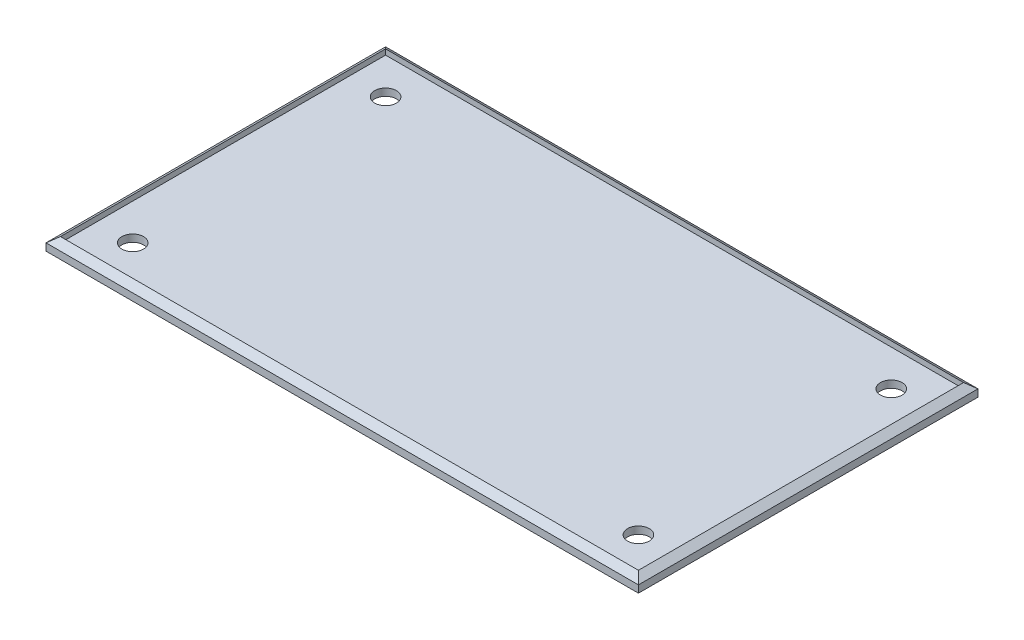
ISO-10303-21;
HEADER;
FILE_DESCRIPTION(('STEP AP214'),'2;1');
FILE_NAME('part.step','',(''),(''),'','','');
FILE_SCHEMA(('AUTOMOTIVE_DESIGN { 1 0 10303 214 1 1 1 1 }'));
ENDSEC;
DATA;
#1=APPLICATION_CONTEXT('core data for automotive mechanical design processes');
#2=APPLICATION_PROTOCOL_DEFINITION('international standard','automotive_design',2000,#1);
#3=PRODUCT_CONTEXT('',#1,'mechanical');
#4=PRODUCT('Part','Part','',(#3));
#5=PRODUCT_RELATED_PRODUCT_CATEGORY('part','',(#4));
#6=PRODUCT_DEFINITION_FORMATION('','',#4);
#7=PRODUCT_DEFINITION_CONTEXT('part definition',#1,'design');
#8=PRODUCT_DEFINITION('design','',#6,#7);
#9=PRODUCT_DEFINITION_SHAPE('','',#8);
#10=(LENGTH_UNIT() NAMED_UNIT(*) SI_UNIT(.MILLI.,.METRE.));
#11=(NAMED_UNIT(*) PLANE_ANGLE_UNIT() SI_UNIT($,.RADIAN.));
#12=(NAMED_UNIT(*) SI_UNIT($,.STERADIAN.) SOLID_ANGLE_UNIT());
#13=UNCERTAINTY_MEASURE_WITH_UNIT(LENGTH_MEASURE(1.E-05),#10,'distance_accuracy_value','');
#14=(GEOMETRIC_REPRESENTATION_CONTEXT(3) GLOBAL_UNCERTAINTY_ASSIGNED_CONTEXT((#13)) GLOBAL_UNIT_ASSIGNED_CONTEXT((#10,
#11,#12)) REPRESENTATION_CONTEXT('',''));
#15=CARTESIAN_POINT('',(0.,0.,0.));
#16=DIRECTION('',(0.,0.,1.));
#17=DIRECTION('',(1.,0.,0.));
#18=AXIS2_PLACEMENT_3D('',#15,#16,#17);
#19=CARTESIAN_POINT('',(-82.,0.,-45.));
#20=DIRECTION('',(-1.,0.,0.));
#21=DIRECTION('',(0.,0.,1.));
#22=AXIS2_PLACEMENT_3D('',#19,#20,#21);
#23=PLANE('',#22);
#24=DIRECTION('',(0.,1.,0.));
#25=VECTOR('',#24,1.);
#26=CARTESIAN_POINT('',(-82.,0.,47.));
#27=LINE('',#26,#25);
#28=CARTESIAN_POINT('',(-82.,0.,47.));
#29=VERTEX_POINT('',#28);
#30=CARTESIAN_POINT('',(-82.,1.99999999999998,47.));
#31=VERTEX_POINT('',#30);
#32=EDGE_CURVE('E219',#29,#31,#27,.T.);
#33=ORIENTED_EDGE('',*,*,#32,.T.);
#34=DIRECTION('',(0.,0.,1.));
#35=VECTOR('',#34,1.);
#36=CARTESIAN_POINT('',(-82.,2.,-45.));
#37=LINE('',#36,#35);
#38=CARTESIAN_POINT('',(-82.,2.,-47.));
#39=VERTEX_POINT('',#38);
#40=EDGE_CURVE('E166',#39,#31,#37,.T.);
#41=ORIENTED_EDGE('',*,*,#40,.F.);
#42=DIRECTION('',(0.,-1.,0.));
#43=VECTOR('',#42,1.);
#44=CARTESIAN_POINT('',(-82.,0.,-47.));
#45=LINE('',#44,#43);
#46=CARTESIAN_POINT('',(-82.,0.,-47.));
#47=VERTEX_POINT('',#46);
#48=EDGE_CURVE('E215',#39,#47,#45,.T.);
#49=ORIENTED_EDGE('',*,*,#48,.T.);
#50=DIRECTION('',(0.,0.,1.));
#51=VECTOR('',#50,1.);
#52=CARTESIAN_POINT('',(-82.,0.,-45.));
#53=LINE('',#52,#51);
#54=EDGE_CURVE('E159',#47,#29,#53,.T.);
#55=ORIENTED_EDGE('',*,*,#54,.T.);
#56=EDGE_LOOP('',(#33,#41,#49,#55));
#57=FACE_BOUND('',#56,.T.);
#58=ADVANCED_FACE('F44',(#57),#23,.T.);
#59=CARTESIAN_POINT('',(82.,0.,-45.));
#60=DIRECTION('',(1.,0.,0.));
#61=DIRECTION('',(0.,0.,-1.));
#62=AXIS2_PLACEMENT_3D('',#59,#60,#61);
#63=PLANE('',#62);
#64=DIRECTION('',(0.,-1.,0.));
#65=VECTOR('',#64,1.);
#66=CARTESIAN_POINT('',(82.,0.,-47.));
#67=LINE('',#66,#65);
#68=CARTESIAN_POINT('',(82.,2.00000000000001,-47.));
#69=VERTEX_POINT('',#68);
#70=CARTESIAN_POINT('',(82.,0.,-47.));
#71=VERTEX_POINT('',#70);
#72=EDGE_CURVE('E211',#69,#71,#67,.T.);
#73=ORIENTED_EDGE('',*,*,#72,.F.);
#74=DIRECTION('',(0.,0.,1.));
#75=VECTOR('',#74,1.);
#76=CARTESIAN_POINT('',(82.,2.,-45.));
#77=LINE('',#76,#75);
#78=CARTESIAN_POINT('',(82.,1.99999999999998,47.));
#79=VERTEX_POINT('',#78);
#80=EDGE_CURVE('E120',#69,#79,#77,.T.);
#81=ORIENTED_EDGE('',*,*,#80,.T.);
#82=DIRECTION('',(0.,1.,0.));
#83=VECTOR('',#82,1.);
#84=CARTESIAN_POINT('',(82.,0.,47.));
#85=LINE('',#84,#83);
#86=CARTESIAN_POINT('',(82.,0.,47.));
#87=VERTEX_POINT('',#86);
#88=EDGE_CURVE('E228',#87,#79,#85,.T.);
#89=ORIENTED_EDGE('',*,*,#88,.F.);
#90=DIRECTION('',(0.,0.,1.));
#91=VECTOR('',#90,1.);
#92=CARTESIAN_POINT('',(82.,0.,-45.));
#93=LINE('',#92,#91);
#94=EDGE_CURVE('E143',#71,#87,#93,.T.);
#95=ORIENTED_EDGE('',*,*,#94,.F.);
#96=EDGE_LOOP('',(#73,#81,#89,#95));
#97=FACE_BOUND('',#96,.T.);
#98=ADVANCED_FACE('F248',(#97),#63,.T.);
#99=CARTESIAN_POINT('',(82.,2.,47.));
#100=DIRECTION('',(0.,0.8,0.6));
#101=DIRECTION('',(0.,-0.6,0.8));
#102=AXIS2_PLACEMENT_3D('',#99,#100,#101);
#103=PLANE('',#102);
#104=DIRECTION('',(-1.,0.,0.));
#105=VECTOR('',#104,1.);
#106=CARTESIAN_POINT('',(82.,3.5,45.));
#107=LINE('',#106,#105);
#108=CARTESIAN_POINT('',(80.,3.5,45.));
#109=VERTEX_POINT('',#108);
#110=CARTESIAN_POINT('',(-80.,3.5,45.));
#111=VERTEX_POINT('',#110);
#112=EDGE_CURVE('E225',#109,#111,#107,.T.);
#113=ORIENTED_EDGE('',*,*,#112,.T.);
#114=DIRECTION('',(-0.624695047554424,-0.468521285665818,0.624695047554424));
#115=VECTOR('',#114,1.);
#116=CARTESIAN_POINT('',(-18.,50.,-17.));
#117=LINE('',#116,#115);
#118=EDGE_CURVE('E199',#111,#31,#117,.T.);
#119=ORIENTED_EDGE('',*,*,#118,.T.);
#120=DIRECTION('',(-1.,0.,0.));
#121=VECTOR('',#120,1.);
#122=CARTESIAN_POINT('',(82.,2.,47.));
#123=LINE('',#122,#121);
#124=EDGE_CURVE('E206',#79,#31,#123,.T.);
#125=ORIENTED_EDGE('',*,*,#124,.F.);
#126=DIRECTION('',(-0.624695047554425,0.468521285665818,-0.624695047554424));
#127=VECTOR('',#126,1.);
#128=CARTESIAN_POINT('',(82.,1.99999999999999,47.));
#129=LINE('',#128,#127);
#130=EDGE_CURVE('E195',#79,#109,#129,.T.);
#131=ORIENTED_EDGE('',*,*,#130,.T.);
#132=EDGE_LOOP('',(#113,#119,#125,#131));
#133=FACE_BOUND('',#132,.T.);
#134=ADVANCED_FACE('F250',(#133),#103,.T.);
#135=CARTESIAN_POINT('',(82.,2.00000000000001,-47.));
#136=DIRECTION('',(0.,0.800000000000003,-0.599999999999996));
#137=DIRECTION('',(0.,0.599999999999996,0.800000000000003));
#138=AXIS2_PLACEMENT_3D('',#135,#136,#137);
#139=PLANE('',#138);
#140=DIRECTION('',(-1.,0.,0.));
#141=VECTOR('',#140,1.);
#142=CARTESIAN_POINT('',(82.,2.00000000000001,-47.));
#143=LINE('',#142,#141);
#144=EDGE_CURVE('E135',#69,#39,#143,.T.);
#145=ORIENTED_EDGE('',*,*,#144,.T.);
#146=DIRECTION('',(0.624695047554422,0.468521285665816,0.624695047554428));
#147=VECTOR('',#146,1.);
#148=CARTESIAN_POINT('',(-18.0000000000005,49.9999999999997,17.0000000000001));
#149=LINE('',#148,#147);
#150=CARTESIAN_POINT('',(-80.,3.5,-45.));
#151=VERTEX_POINT('',#150);
#152=EDGE_CURVE('E11',#39,#151,#149,.T.);
#153=ORIENTED_EDGE('',*,*,#152,.T.);
#154=DIRECTION('',(-1.,0.,0.));
#155=VECTOR('',#154,1.);
#156=CARTESIAN_POINT('',(82.,3.5,-45.));
#157=LINE('',#156,#155);
#158=CARTESIAN_POINT('',(80.,3.5,-45.));
#159=VERTEX_POINT('',#158);
#160=EDGE_CURVE('E128',#159,#151,#157,.T.);
#161=ORIENTED_EDGE('',*,*,#160,.F.);
#162=DIRECTION('',(0.624695047554423,-0.468521285665816,-0.624695047554428));
#163=VECTOR('',#162,1.);
#164=CARTESIAN_POINT('',(82.,2.,-47.));
#165=LINE('',#164,#163);
#166=EDGE_CURVE('E54',#159,#69,#165,.T.);
#167=ORIENTED_EDGE('',*,*,#166,.T.);
#168=EDGE_LOOP('',(#145,#153,#161,#167));
#169=FACE_BOUND('',#168,.T.);
#170=ADVANCED_FACE('F130',(#169),#139,.T.);
#171=CARTESIAN_POINT('',(0.,2.,0.));
#172=DIRECTION('',(0.,1.,0.));
#173=DIRECTION('',(0.,0.,1.));
#174=AXIS2_PLACEMENT_3D('',#171,#172,#173);
#175=PLANE('',#174);
#176=CARTESIAN_POINT('',(-70.,2.,35.));
#177=DIRECTION('',(0.,1.,0.));
#178=DIRECTION('',(0.,0.,1.));
#179=AXIS2_PLACEMENT_3D('',#176,#177,#178);
#180=CIRCLE('',#179,3.00000000000001);
#181=CARTESIAN_POINT('',(-70.,2.,38.));
#182=VERTEX_POINT('',#181);
#183=EDGE_CURVE('E339',#182,#182,#180,.T.);
#184=ORIENTED_EDGE('',*,*,#183,.F.);
#185=EDGE_LOOP('',(#184));
#186=FACE_BOUND('',#185,.T.);
#187=CARTESIAN_POINT('',(70.,2.,35.));
#188=DIRECTION('',(0.,1.,0.));
#189=DIRECTION('',(0.,0.,1.));
#190=AXIS2_PLACEMENT_3D('',#187,#188,#189);
#191=CIRCLE('',#190,3.00000000000001);
#192=CARTESIAN_POINT('',(70.,2.,38.));
#193=VERTEX_POINT('',#192);
#194=EDGE_CURVE('E333',#193,#193,#191,.T.);
#195=ORIENTED_EDGE('',*,*,#194,.F.);
#196=EDGE_LOOP('',(#195));
#197=FACE_BOUND('',#196,.T.);
#198=CARTESIAN_POINT('',(70.,2.,-35.));
#199=DIRECTION('',(0.,1.,0.));
#200=DIRECTION('',(0.,0.,1.));
#201=AXIS2_PLACEMENT_3D('',#198,#199,#200);
#202=CIRCLE('',#201,3.00000000000001);
#203=CARTESIAN_POINT('',(70.,2.,-32.));
#204=VERTEX_POINT('',#203);
#205=EDGE_CURVE('E323',#204,#204,#202,.T.);
#206=ORIENTED_EDGE('',*,*,#205,.F.);
#207=EDGE_LOOP('',(#206));
#208=FACE_BOUND('',#207,.T.);
#209=CARTESIAN_POINT('',(-70.,2.,-35.));
#210=DIRECTION('',(0.,1.,0.));
#211=DIRECTION('',(0.,0.,1.));
#212=AXIS2_PLACEMENT_3D('',#209,#210,#211);
#213=CIRCLE('',#212,3.00000000000001);
#214=CARTESIAN_POINT('',(-70.,2.,-32.));
#215=VERTEX_POINT('',#214);
#216=EDGE_CURVE('E185',#215,#215,#213,.T.);
#217=ORIENTED_EDGE('',*,*,#216,.F.);
#218=EDGE_LOOP('',(#217));
#219=FACE_BOUND('',#218,.T.);
#220=DIRECTION('',(0.,0.,-1.));
#221=VECTOR('',#220,1.);
#222=CARTESIAN_POINT('',(80.,2.,-45.));
#223=LINE('',#222,#221);
#224=CARTESIAN_POINT('',(80.,2.,45.));
#225=VERTEX_POINT('',#224);
#226=CARTESIAN_POINT('',(80.,2.,-45.));
#227=VERTEX_POINT('',#226);
#228=EDGE_CURVE('E70',#225,#227,#223,.T.);
#229=ORIENTED_EDGE('',*,*,#228,.T.);
#230=DIRECTION('',(-1.,0.,0.));
#231=VECTOR('',#230,1.);
#232=CARTESIAN_POINT('',(-80.,2.,-45.));
#233=LINE('',#232,#231);
#234=CARTESIAN_POINT('',(-80.,2.,-45.));
#235=VERTEX_POINT('',#234);
#236=EDGE_CURVE('E141',#227,#235,#233,.T.);
#237=ORIENTED_EDGE('',*,*,#236,.T.);
#238=DIRECTION('',(0.,0.,1.));
#239=VECTOR('',#238,1.);
#240=CARTESIAN_POINT('',(-80.,2.,-45.));
#241=LINE('',#240,#239);
#242=CARTESIAN_POINT('',(-80.,2.,45.));
#243=VERTEX_POINT('',#242);
#244=EDGE_CURVE('E175',#235,#243,#241,.T.);
#245=ORIENTED_EDGE('',*,*,#244,.T.);
#246=DIRECTION('',(1.,0.,0.));
#247=VECTOR('',#246,1.);
#248=CARTESIAN_POINT('',(-80.,2.,45.));
#249=LINE('',#248,#247);
#250=EDGE_CURVE('E125',#243,#225,#249,.T.);
#251=ORIENTED_EDGE('',*,*,#250,.T.);
#252=EDGE_LOOP('',(#229,#237,#245,#251));
#253=FACE_BOUND('',#252,.T.);
#254=ADVANCED_FACE('F259',(#186,#197,#208,#219,#253),#175,.T.);
#255=CARTESIAN_POINT('',(0.,0.,0.));
#256=DIRECTION('',(0.,1.,0.));
#257=DIRECTION('',(0.,0.,1.));
#258=AXIS2_PLACEMENT_3D('',#255,#256,#257);
#259=PLANE('',#258);
#260=CARTESIAN_POINT('',(-70.,0.,35.));
#261=DIRECTION('',(0.,1.,0.));
#262=DIRECTION('',(0.,0.,1.));
#263=AXIS2_PLACEMENT_3D('',#260,#261,#262);
#264=CIRCLE('',#263,3.00000000000001);
#265=CARTESIAN_POINT('',(-70.,0.,38.));
#266=VERTEX_POINT('',#265);
#267=EDGE_CURVE('E48',#266,#266,#264,.T.);
#268=ORIENTED_EDGE('',*,*,#267,.T.);
#269=EDGE_LOOP('',(#268));
#270=FACE_BOUND('',#269,.T.);
#271=CARTESIAN_POINT('',(70.,0.,35.));
#272=DIRECTION('',(0.,1.,0.));
#273=DIRECTION('',(0.,0.,1.));
#274=AXIS2_PLACEMENT_3D('',#271,#272,#273);
#275=CIRCLE('',#274,3.00000000000001);
#276=CARTESIAN_POINT('',(70.,0.,38.));
#277=VERTEX_POINT('',#276);
#278=EDGE_CURVE('E188',#277,#277,#275,.T.);
#279=ORIENTED_EDGE('',*,*,#278,.T.);
#280=EDGE_LOOP('',(#279));
#281=FACE_BOUND('',#280,.T.);
#282=CARTESIAN_POINT('',(70.,0.,-35.));
#283=DIRECTION('',(0.,1.,0.));
#284=DIRECTION('',(0.,0.,1.));
#285=AXIS2_PLACEMENT_3D('',#282,#283,#284);
#286=CIRCLE('',#285,3.00000000000001);
#287=CARTESIAN_POINT('',(70.,0.,-32.));
#288=VERTEX_POINT('',#287);
#289=EDGE_CURVE('E184',#288,#288,#286,.T.);
#290=ORIENTED_EDGE('',*,*,#289,.T.);
#291=EDGE_LOOP('',(#290));
#292=FACE_BOUND('',#291,.T.);
#293=CARTESIAN_POINT('',(-70.,0.,-35.));
#294=DIRECTION('',(0.,1.,0.));
#295=DIRECTION('',(0.,0.,1.));
#296=AXIS2_PLACEMENT_3D('',#293,#294,#295);
#297=CIRCLE('',#296,3.00000000000001);
#298=CARTESIAN_POINT('',(-70.,0.,-32.));
#299=VERTEX_POINT('',#298);
#300=EDGE_CURVE('E180',#299,#299,#297,.T.);
#301=ORIENTED_EDGE('',*,*,#300,.T.);
#302=EDGE_LOOP('',(#301));
#303=FACE_BOUND('',#302,.T.);
#304=ORIENTED_EDGE('',*,*,#54,.F.);
#305=DIRECTION('',(-1.,0.,0.));
#306=VECTOR('',#305,1.);
#307=CARTESIAN_POINT('',(82.,0.,-47.));
#308=LINE('',#307,#306);
#309=EDGE_CURVE('E136',#71,#47,#308,.T.);
#310=ORIENTED_EDGE('',*,*,#309,.F.);
#311=ORIENTED_EDGE('',*,*,#94,.T.);
#312=DIRECTION('',(-1.,0.,0.));
#313=VECTOR('',#312,1.);
#314=CARTESIAN_POINT('',(82.,0.,47.));
#315=LINE('',#314,#313);
#316=EDGE_CURVE('E229',#87,#29,#315,.T.);
#317=ORIENTED_EDGE('',*,*,#316,.T.);
#318=EDGE_LOOP('',(#304,#310,#311,#317));
#319=FACE_BOUND('',#318,.T.);
#320=ADVANCED_FACE('F46',(#270,#281,#292,#303,#319),#259,.F.);
#321=CARTESIAN_POINT('',(-80.,0.,-45.));
#322=DIRECTION('',(1.,0.,0.));
#323=DIRECTION('',(0.,0.,-1.));
#324=AXIS2_PLACEMENT_3D('',#321,#322,#323);
#325=PLANE('',#324);
#326=ORIENTED_EDGE('',*,*,#244,.F.);
#327=DIRECTION('',(0.,1.,0.));
#328=VECTOR('',#327,1.);
#329=CARTESIAN_POINT('',(-80.,0.,-45.));
#330=LINE('',#329,#328);
#331=EDGE_CURVE('E162',#235,#151,#330,.T.);
#332=ORIENTED_EDGE('',*,*,#331,.T.);
#333=DIRECTION('',(0.,0.,1.));
#334=VECTOR('',#333,1.);
#335=CARTESIAN_POINT('',(-80.,3.5,-45.));
#336=LINE('',#335,#334);
#337=EDGE_CURVE('E163',#151,#111,#336,.T.);
#338=ORIENTED_EDGE('',*,*,#337,.T.);
#339=DIRECTION('',(0.,1.,0.));
#340=VECTOR('',#339,1.);
#341=CARTESIAN_POINT('',(-80.,0.,45.));
#342=LINE('',#341,#340);
#343=EDGE_CURVE('E62',#243,#111,#342,.T.);
#344=ORIENTED_EDGE('',*,*,#343,.F.);
#345=EDGE_LOOP('',(#326,#332,#338,#344));
#346=FACE_BOUND('',#345,.T.);
#347=ADVANCED_FACE('F254',(#346),#325,.T.);
#348=CARTESIAN_POINT('',(-82.,2.,-45.));
#349=DIRECTION('',(-0.6,0.8,0.));
#350=DIRECTION('',(-0.8,-0.6,0.));
#351=AXIS2_PLACEMENT_3D('',#348,#349,#350);
#352=PLANE('',#351);
#353=ORIENTED_EDGE('',*,*,#40,.T.);
#354=ORIENTED_EDGE('',*,*,#118,.F.);
#355=ORIENTED_EDGE('',*,*,#337,.F.);
#356=ORIENTED_EDGE('',*,*,#152,.F.);
#357=EDGE_LOOP('',(#353,#354,#355,#356));
#358=FACE_BOUND('',#357,.T.);
#359=ADVANCED_FACE('F253',(#358),#352,.T.);
#360=CARTESIAN_POINT('',(80.,0.,-45.));
#361=DIRECTION('',(-1.,0.,0.));
#362=DIRECTION('',(0.,0.,1.));
#363=AXIS2_PLACEMENT_3D('',#360,#361,#362);
#364=PLANE('',#363);
#365=ORIENTED_EDGE('',*,*,#228,.F.);
#366=DIRECTION('',(0.,-1.,0.));
#367=VECTOR('',#366,1.);
#368=CARTESIAN_POINT('',(80.,0.,45.));
#369=LINE('',#368,#367);
#370=EDGE_CURVE('E144',#109,#225,#369,.T.);
#371=ORIENTED_EDGE('',*,*,#370,.F.);
#372=DIRECTION('',(0.,0.,1.));
#373=VECTOR('',#372,1.);
#374=CARTESIAN_POINT('',(80.,3.5,-45.));
#375=LINE('',#374,#373);
#376=EDGE_CURVE('E119',#159,#109,#375,.T.);
#377=ORIENTED_EDGE('',*,*,#376,.F.);
#378=DIRECTION('',(0.,-1.,0.));
#379=VECTOR('',#378,1.);
#380=CARTESIAN_POINT('',(80.,0.,-45.));
#381=LINE('',#380,#379);
#382=EDGE_CURVE('E138',#159,#227,#381,.T.);
#383=ORIENTED_EDGE('',*,*,#382,.T.);
#384=EDGE_LOOP('',(#365,#371,#377,#383));
#385=FACE_BOUND('',#384,.T.);
#386=ADVANCED_FACE('F146',(#385),#364,.T.);
#387=CARTESIAN_POINT('',(82.,2.,-45.));
#388=DIRECTION('',(0.6,0.8,0.));
#389=DIRECTION('',(-0.8,0.6,0.));
#390=AXIS2_PLACEMENT_3D('',#387,#388,#389);
#391=PLANE('',#390);
#392=ORIENTED_EDGE('',*,*,#376,.T.);
#393=ORIENTED_EDGE('',*,*,#130,.F.);
#394=ORIENTED_EDGE('',*,*,#80,.F.);
#395=ORIENTED_EDGE('',*,*,#166,.F.);
#396=EDGE_LOOP('',(#392,#393,#394,#395));
#397=FACE_BOUND('',#396,.T.);
#398=ADVANCED_FACE('F116',(#397),#391,.T.);
#399=CARTESIAN_POINT('',(82.,0.,45.));
#400=DIRECTION('',(0.,0.,-1.));
#401=DIRECTION('',(-1.,0.,0.));
#402=AXIS2_PLACEMENT_3D('',#399,#400,#401);
#403=PLANE('',#402);
#404=ORIENTED_EDGE('',*,*,#112,.F.);
#405=ORIENTED_EDGE('',*,*,#370,.T.);
#406=ORIENTED_EDGE('',*,*,#250,.F.);
#407=ORIENTED_EDGE('',*,*,#343,.T.);
#408=EDGE_LOOP('',(#404,#405,#406,#407));
#409=FACE_BOUND('',#408,.T.);
#410=ADVANCED_FACE('F257',(#409),#403,.T.);
#411=CARTESIAN_POINT('',(82.,0.,47.));
#412=DIRECTION('',(0.,0.,1.));
#413=DIRECTION('',(1.,0.,0.));
#414=AXIS2_PLACEMENT_3D('',#411,#412,#413);
#415=PLANE('',#414);
#416=ORIENTED_EDGE('',*,*,#32,.F.);
#417=ORIENTED_EDGE('',*,*,#316,.F.);
#418=ORIENTED_EDGE('',*,*,#88,.T.);
#419=ORIENTED_EDGE('',*,*,#124,.T.);
#420=EDGE_LOOP('',(#416,#417,#418,#419));
#421=FACE_BOUND('',#420,.T.);
#422=ADVANCED_FACE('F245',(#421),#415,.T.);
#423=CARTESIAN_POINT('',(82.,0.,-45.));
#424=DIRECTION('',(0.,0.,1.));
#425=DIRECTION('',(1.,0.,0.));
#426=AXIS2_PLACEMENT_3D('',#423,#424,#425);
#427=PLANE('',#426);
#428=ORIENTED_EDGE('',*,*,#331,.F.);
#429=ORIENTED_EDGE('',*,*,#236,.F.);
#430=ORIENTED_EDGE('',*,*,#382,.F.);
#431=ORIENTED_EDGE('',*,*,#160,.T.);
#432=EDGE_LOOP('',(#428,#429,#430,#431));
#433=FACE_BOUND('',#432,.T.);
#434=ADVANCED_FACE('F139',(#433),#427,.T.);
#435=CARTESIAN_POINT('',(82.,0.,-47.));
#436=DIRECTION('',(0.,0.,-1.));
#437=DIRECTION('',(-1.,0.,0.));
#438=AXIS2_PLACEMENT_3D('',#435,#436,#437);
#439=PLANE('',#438);
#440=ORIENTED_EDGE('',*,*,#48,.F.);
#441=ORIENTED_EDGE('',*,*,#144,.F.);
#442=ORIENTED_EDGE('',*,*,#72,.T.);
#443=ORIENTED_EDGE('',*,*,#309,.T.);
#444=EDGE_LOOP('',(#440,#441,#442,#443));
#445=FACE_BOUND('',#444,.T.);
#446=ADVANCED_FACE('F298',(#445),#439,.T.);
#447=CARTESIAN_POINT('',(-70.,-162.,-35.));
#448=DIRECTION('',(0.,1.,0.));
#449=DIRECTION('',(0.,0.,1.));
#450=AXIS2_PLACEMENT_3D('',#447,#448,#449);
#451=CYLINDRICAL_SURFACE('',#450,3.00000000000001);
#452=ORIENTED_EDGE('',*,*,#216,.T.);
#453=EDGE_LOOP('',(#452));
#454=FACE_BOUND('',#453,.T.);
#455=ORIENTED_EDGE('',*,*,#300,.F.);
#456=EDGE_LOOP('',(#455));
#457=FACE_BOUND('',#456,.T.);
#458=ADVANCED_FACE('F300',(#454,#457),#451,.F.);
#459=CARTESIAN_POINT('',(70.,-162.,-35.));
#460=DIRECTION('',(0.,1.,0.));
#461=DIRECTION('',(0.,0.,1.));
#462=AXIS2_PLACEMENT_3D('',#459,#460,#461);
#463=CYLINDRICAL_SURFACE('',#462,3.00000000000001);
#464=ORIENTED_EDGE('',*,*,#205,.T.);
#465=EDGE_LOOP('',(#464));
#466=FACE_BOUND('',#465,.T.);
#467=ORIENTED_EDGE('',*,*,#289,.F.);
#468=EDGE_LOOP('',(#467));
#469=FACE_BOUND('',#468,.T.);
#470=ADVANCED_FACE('F306',(#466,#469),#463,.F.);
#471=CARTESIAN_POINT('',(70.,-162.,35.));
#472=DIRECTION('',(0.,1.,0.));
#473=DIRECTION('',(0.,0.,1.));
#474=AXIS2_PLACEMENT_3D('',#471,#472,#473);
#475=CYLINDRICAL_SURFACE('',#474,3.00000000000001);
#476=ORIENTED_EDGE('',*,*,#194,.T.);
#477=EDGE_LOOP('',(#476));
#478=FACE_BOUND('',#477,.T.);
#479=ORIENTED_EDGE('',*,*,#278,.F.);
#480=EDGE_LOOP('',(#479));
#481=FACE_BOUND('',#480,.T.);
#482=ADVANCED_FACE('F311',(#478,#481),#475,.F.);
#483=CARTESIAN_POINT('',(-70.,-162.,35.));
#484=DIRECTION('',(0.,1.,0.));
#485=DIRECTION('',(0.,0.,1.));
#486=AXIS2_PLACEMENT_3D('',#483,#484,#485);
#487=CYLINDRICAL_SURFACE('',#486,3.00000000000001);
#488=ORIENTED_EDGE('',*,*,#183,.T.);
#489=EDGE_LOOP('',(#488));
#490=FACE_BOUND('',#489,.T.);
#491=ORIENTED_EDGE('',*,*,#267,.F.);
#492=EDGE_LOOP('',(#491));
#493=FACE_BOUND('',#492,.T.);
#494=ADVANCED_FACE('F308',(#490,#493),#487,.F.);
#495=CLOSED_SHELL('',(#58,#98,#134,#170,#254,#320,#347,#359,#386,#398,#410,#422,#434,#446,#458,
#470,#482,#494));
#496=MANIFOLD_SOLID_BREP('B2',#495);
#497=ADVANCED_BREP_SHAPE_REPRESENTATION('',(#18,#496),#14);
#498=SHAPE_DEFINITION_REPRESENTATION(#9,#497);
ENDSEC;
END-ISO-10303-21;
